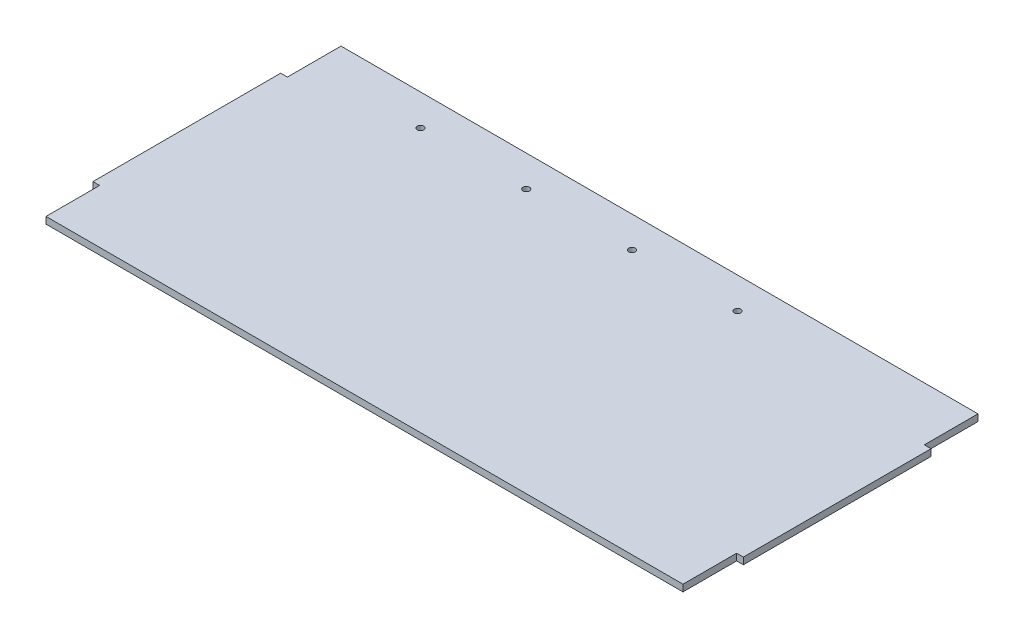
ISO-10303-21;
HEADER;
FILE_DESCRIPTION(('STEP AP214'),'2;1');
FILE_NAME('part.step','',(''),(''),'','','');
FILE_SCHEMA(('AUTOMOTIVE_DESIGN { 1 0 10303 214 1 1 1 1 }'));
ENDSEC;
DATA;
#1=APPLICATION_CONTEXT('core data for automotive mechanical design processes');
#2=APPLICATION_PROTOCOL_DEFINITION('international standard','automotive_design',2000,#1);
#3=PRODUCT_CONTEXT('',#1,'mechanical');
#4=PRODUCT('Part','Part','',(#3));
#5=PRODUCT_RELATED_PRODUCT_CATEGORY('part','',(#4));
#6=PRODUCT_DEFINITION_FORMATION('','',#4);
#7=PRODUCT_DEFINITION_CONTEXT('part definition',#1,'design');
#8=PRODUCT_DEFINITION('design','',#6,#7);
#9=PRODUCT_DEFINITION_SHAPE('','',#8);
#10=(LENGTH_UNIT() NAMED_UNIT(*) SI_UNIT(.MILLI.,.METRE.));
#11=(NAMED_UNIT(*) PLANE_ANGLE_UNIT() SI_UNIT($,.RADIAN.));
#12=(NAMED_UNIT(*) SI_UNIT($,.STERADIAN.) SOLID_ANGLE_UNIT());
#13=UNCERTAINTY_MEASURE_WITH_UNIT(LENGTH_MEASURE(1.E-05),#10,'distance_accuracy_value','');
#14=(GEOMETRIC_REPRESENTATION_CONTEXT(3) GLOBAL_UNCERTAINTY_ASSIGNED_CONTEXT((#13)) GLOBAL_UNIT_ASSIGNED_CONTEXT((#10,
#11,#12)) REPRESENTATION_CONTEXT('',''));
#15=CARTESIAN_POINT('',(0.,0.,0.));
#16=DIRECTION('',(0.,0.,1.));
#17=DIRECTION('',(1.,0.,0.));
#18=AXIS2_PLACEMENT_3D('',#15,#16,#17);
#19=CARTESIAN_POINT('',(150.8125,3.175,-44.45));
#20=DIRECTION('',(-1.,0.,0.));
#21=DIRECTION('',(0.,0.,1.));
#22=AXIS2_PLACEMENT_3D('',#19,#20,#21);
#23=PLANE('',#22);
#24=DIRECTION('',(0.,0.,-1.));
#25=VECTOR('',#24,1.);
#26=CARTESIAN_POINT('',(150.8125,0.,-44.45));
#27=LINE('',#26,#25);
#28=CARTESIAN_POINT('',(150.8125,0.,-44.45));
#29=VERTEX_POINT('',#28);
#30=CARTESIAN_POINT('',(150.8125,0.,-69.85));
#31=VERTEX_POINT('',#30);
#32=EDGE_CURVE('E155',#29,#31,#27,.T.);
#33=ORIENTED_EDGE('',*,*,#32,.T.);
#34=DIRECTION('',(0.,-1.,0.));
#35=VECTOR('',#34,1.);
#36=CARTESIAN_POINT('',(150.8125,3.175,-69.85));
#37=LINE('',#36,#35);
#38=CARTESIAN_POINT('',(150.8125,3.175,-69.85));
#39=VERTEX_POINT('',#38);
#40=EDGE_CURVE('E11',#39,#31,#37,.T.);
#41=ORIENTED_EDGE('',*,*,#40,.F.);
#42=DIRECTION('',(0.,0.,-1.));
#43=VECTOR('',#42,1.);
#44=CARTESIAN_POINT('',(150.8125,3.175,-44.45));
#45=LINE('',#44,#43);
#46=CARTESIAN_POINT('',(150.8125,3.175,-44.45));
#47=VERTEX_POINT('',#46);
#48=EDGE_CURVE('E178',#47,#39,#45,.T.);
#49=ORIENTED_EDGE('',*,*,#48,.F.);
#50=DIRECTION('',(0.,-1.,0.));
#51=VECTOR('',#50,1.);
#52=CARTESIAN_POINT('',(150.8125,3.175,-44.45));
#53=LINE('',#52,#51);
#54=EDGE_CURVE('E151',#47,#29,#53,.T.);
#55=ORIENTED_EDGE('',*,*,#54,.T.);
#56=EDGE_LOOP('',(#33,#41,#49,#55));
#57=FACE_BOUND('',#56,.T.);
#58=ADVANCED_FACE('F35',(#57),#23,.F.);
#59=CARTESIAN_POINT('',(-150.8125,3.175,-69.85));
#60=DIRECTION('',(0.,0.,1.));
#61=DIRECTION('',(1.,0.,0.));
#62=AXIS2_PLACEMENT_3D('',#59,#60,#61);
#63=PLANE('',#62);
#64=DIRECTION('',(-1.,0.,0.));
#65=VECTOR('',#64,1.);
#66=CARTESIAN_POINT('',(-150.8125,0.,-69.85));
#67=LINE('',#66,#65);
#68=CARTESIAN_POINT('',(-150.8125,0.,-69.85));
#69=VERTEX_POINT('',#68);
#70=EDGE_CURVE('E158',#31,#69,#67,.T.);
#71=ORIENTED_EDGE('',*,*,#70,.T.);
#72=DIRECTION('',(0.,-1.,0.));
#73=VECTOR('',#72,1.);
#74=CARTESIAN_POINT('',(-150.8125,3.175,-69.85));
#75=LINE('',#74,#73);
#76=CARTESIAN_POINT('',(-150.8125,3.175,-69.85));
#77=VERTEX_POINT('',#76);
#78=EDGE_CURVE('E43',#77,#69,#75,.T.);
#79=ORIENTED_EDGE('',*,*,#78,.F.);
#80=DIRECTION('',(-1.,0.,0.));
#81=VECTOR('',#80,1.);
#82=CARTESIAN_POINT('',(-150.8125,3.175,-69.85));
#83=LINE('',#82,#81);
#84=EDGE_CURVE('E106',#39,#77,#83,.T.);
#85=ORIENTED_EDGE('',*,*,#84,.F.);
#86=ORIENTED_EDGE('',*,*,#40,.T.);
#87=EDGE_LOOP('',(#71,#79,#85,#86));
#88=FACE_BOUND('',#87,.T.);
#89=ADVANCED_FACE('F257',(#88),#63,.F.);
#90=CARTESIAN_POINT('',(-150.8125,3.175,-44.45));
#91=DIRECTION('',(1.,0.,0.));
#92=DIRECTION('',(0.,0.,-1.));
#93=AXIS2_PLACEMENT_3D('',#90,#91,#92);
#94=PLANE('',#93);
#95=DIRECTION('',(0.,0.,1.));
#96=VECTOR('',#95,1.);
#97=CARTESIAN_POINT('',(-150.8125,0.,-44.45));
#98=LINE('',#97,#96);
#99=CARTESIAN_POINT('',(-150.8125,0.,-44.45));
#100=VERTEX_POINT('',#99);
#101=EDGE_CURVE('E161',#69,#100,#98,.T.);
#102=ORIENTED_EDGE('',*,*,#101,.T.);
#103=DIRECTION('',(0.,-1.,0.));
#104=VECTOR('',#103,1.);
#105=CARTESIAN_POINT('',(-150.8125,3.175,-44.45));
#106=LINE('',#105,#104);
#107=CARTESIAN_POINT('',(-150.8125,3.175,-44.45));
#108=VERTEX_POINT('',#107);
#109=EDGE_CURVE('E197',#108,#100,#106,.T.);
#110=ORIENTED_EDGE('',*,*,#109,.F.);
#111=DIRECTION('',(0.,0.,1.));
#112=VECTOR('',#111,1.);
#113=CARTESIAN_POINT('',(-150.8125,3.175,-44.45));
#114=LINE('',#113,#112);
#115=EDGE_CURVE('E205',#77,#108,#114,.T.);
#116=ORIENTED_EDGE('',*,*,#115,.F.);
#117=ORIENTED_EDGE('',*,*,#78,.T.);
#118=EDGE_LOOP('',(#102,#110,#116,#117));
#119=FACE_BOUND('',#118,.T.);
#120=ADVANCED_FACE('F203',(#119),#94,.F.);
#121=CARTESIAN_POINT('',(-150.8125,3.175,-44.45));
#122=DIRECTION('',(0.,0.,1.));
#123=DIRECTION('',(1.,0.,0.));
#124=AXIS2_PLACEMENT_3D('',#121,#122,#123);
#125=PLANE('',#124);
#126=DIRECTION('',(-1.,0.,0.));
#127=VECTOR('',#126,1.);
#128=CARTESIAN_POINT('',(-150.8125,0.,-44.45));
#129=LINE('',#128,#127);
#130=CARTESIAN_POINT('',(-153.9875,0.,-44.45));
#131=VERTEX_POINT('',#130);
#132=EDGE_CURVE('E163',#100,#131,#129,.T.);
#133=ORIENTED_EDGE('',*,*,#132,.T.);
#134=DIRECTION('',(0.,-1.,0.));
#135=VECTOR('',#134,1.);
#136=CARTESIAN_POINT('',(-153.9875,3.175,-44.45));
#137=LINE('',#136,#135);
#138=CARTESIAN_POINT('',(-153.9875,3.175,-44.45));
#139=VERTEX_POINT('',#138);
#140=EDGE_CURVE('E194',#139,#131,#137,.T.);
#141=ORIENTED_EDGE('',*,*,#140,.F.);
#142=DIRECTION('',(-1.,0.,0.));
#143=VECTOR('',#142,1.);
#144=CARTESIAN_POINT('',(-150.8125,3.175,-44.45));
#145=LINE('',#144,#143);
#146=EDGE_CURVE('E223',#108,#139,#145,.T.);
#147=ORIENTED_EDGE('',*,*,#146,.F.);
#148=ORIENTED_EDGE('',*,*,#109,.T.);
#149=EDGE_LOOP('',(#133,#141,#147,#148));
#150=FACE_BOUND('',#149,.T.);
#151=ADVANCED_FACE('F214',(#150),#125,.F.);
#152=CARTESIAN_POINT('',(-153.9875,3.175,-44.45));
#153=DIRECTION('',(1.,0.,0.));
#154=DIRECTION('',(0.,0.,-1.));
#155=AXIS2_PLACEMENT_3D('',#152,#153,#154);
#156=PLANE('',#155);
#157=DIRECTION('',(0.,0.,1.));
#158=VECTOR('',#157,1.);
#159=CARTESIAN_POINT('',(-153.9875,0.,-44.45));
#160=LINE('',#159,#158);
#161=CARTESIAN_POINT('',(-153.9875,0.,44.45));
#162=VERTEX_POINT('',#161);
#163=EDGE_CURVE('E165',#131,#162,#160,.T.);
#164=ORIENTED_EDGE('',*,*,#163,.T.);
#165=DIRECTION('',(0.,-1.,0.));
#166=VECTOR('',#165,1.);
#167=CARTESIAN_POINT('',(-153.9875,3.175,44.45));
#168=LINE('',#167,#166);
#169=CARTESIAN_POINT('',(-153.9875,3.175,44.45));
#170=VERTEX_POINT('',#169);
#171=EDGE_CURVE('E191',#170,#162,#168,.T.);
#172=ORIENTED_EDGE('',*,*,#171,.F.);
#173=DIRECTION('',(0.,0.,1.));
#174=VECTOR('',#173,1.);
#175=CARTESIAN_POINT('',(-153.9875,3.175,-44.45));
#176=LINE('',#175,#174);
#177=EDGE_CURVE('E220',#139,#170,#176,.T.);
#178=ORIENTED_EDGE('',*,*,#177,.F.);
#179=ORIENTED_EDGE('',*,*,#140,.T.);
#180=EDGE_LOOP('',(#164,#172,#178,#179));
#181=FACE_BOUND('',#180,.T.);
#182=ADVANCED_FACE('F218',(#181),#156,.F.);
#183=CARTESIAN_POINT('',(-153.9875,3.175,44.45));
#184=DIRECTION('',(0.,0.,-1.));
#185=DIRECTION('',(-1.,0.,0.));
#186=AXIS2_PLACEMENT_3D('',#183,#184,#185);
#187=PLANE('',#186);
#188=DIRECTION('',(1.,0.,0.));
#189=VECTOR('',#188,1.);
#190=CARTESIAN_POINT('',(-153.9875,0.,44.45));
#191=LINE('',#190,#189);
#192=CARTESIAN_POINT('',(-150.8125,0.,44.45));
#193=VERTEX_POINT('',#192);
#194=EDGE_CURVE('E167',#162,#193,#191,.T.);
#195=ORIENTED_EDGE('',*,*,#194,.T.);
#196=DIRECTION('',(0.,-1.,0.));
#197=VECTOR('',#196,1.);
#198=CARTESIAN_POINT('',(-150.8125,3.175,44.45));
#199=LINE('',#198,#197);
#200=CARTESIAN_POINT('',(-150.8125,3.175,44.45));
#201=VERTEX_POINT('',#200);
#202=EDGE_CURVE('E188',#201,#193,#199,.T.);
#203=ORIENTED_EDGE('',*,*,#202,.F.);
#204=DIRECTION('',(1.,0.,0.));
#205=VECTOR('',#204,1.);
#206=CARTESIAN_POINT('',(-153.9875,3.175,44.45));
#207=LINE('',#206,#205);
#208=EDGE_CURVE('E222',#170,#201,#207,.T.);
#209=ORIENTED_EDGE('',*,*,#208,.F.);
#210=ORIENTED_EDGE('',*,*,#171,.T.);
#211=EDGE_LOOP('',(#195,#203,#209,#210));
#212=FACE_BOUND('',#211,.T.);
#213=ADVANCED_FACE('F270',(#212),#187,.F.);
#214=CARTESIAN_POINT('',(-150.8125,3.175,69.85));
#215=DIRECTION('',(1.,0.,0.));
#216=DIRECTION('',(0.,0.,-1.));
#217=AXIS2_PLACEMENT_3D('',#214,#215,#216);
#218=PLANE('',#217);
#219=DIRECTION('',(0.,0.,1.));
#220=VECTOR('',#219,1.);
#221=CARTESIAN_POINT('',(-150.8125,0.,69.85));
#222=LINE('',#221,#220);
#223=CARTESIAN_POINT('',(-150.8125,0.,69.85));
#224=VERTEX_POINT('',#223);
#225=EDGE_CURVE('E169',#193,#224,#222,.T.);
#226=ORIENTED_EDGE('',*,*,#225,.T.);
#227=DIRECTION('',(0.,-1.,0.));
#228=VECTOR('',#227,1.);
#229=CARTESIAN_POINT('',(-150.8125,3.175,69.85));
#230=LINE('',#229,#228);
#231=CARTESIAN_POINT('',(-150.8125,3.175,69.85));
#232=VERTEX_POINT('',#231);
#233=EDGE_CURVE('E185',#232,#224,#230,.T.);
#234=ORIENTED_EDGE('',*,*,#233,.F.);
#235=DIRECTION('',(0.,0.,1.));
#236=VECTOR('',#235,1.);
#237=CARTESIAN_POINT('',(-150.8125,3.175,69.85));
#238=LINE('',#237,#236);
#239=EDGE_CURVE('E225',#201,#232,#238,.T.);
#240=ORIENTED_EDGE('',*,*,#239,.F.);
#241=ORIENTED_EDGE('',*,*,#202,.T.);
#242=EDGE_LOOP('',(#226,#234,#240,#241));
#243=FACE_BOUND('',#242,.T.);
#244=ADVANCED_FACE('F273',(#243),#218,.F.);
#245=CARTESIAN_POINT('',(-150.8125,3.175,69.85));
#246=DIRECTION('',(0.,0.,-1.));
#247=DIRECTION('',(-1.,0.,0.));
#248=AXIS2_PLACEMENT_3D('',#245,#246,#247);
#249=PLANE('',#248);
#250=DIRECTION('',(1.,0.,0.));
#251=VECTOR('',#250,1.);
#252=CARTESIAN_POINT('',(-150.8125,0.,69.85));
#253=LINE('',#252,#251);
#254=CARTESIAN_POINT('',(150.8125,0.,69.85));
#255=VERTEX_POINT('',#254);
#256=EDGE_CURVE('E171',#224,#255,#253,.T.);
#257=ORIENTED_EDGE('',*,*,#256,.T.);
#258=DIRECTION('',(0.,-1.,0.));
#259=VECTOR('',#258,1.);
#260=CARTESIAN_POINT('',(150.8125,3.175,69.85));
#261=LINE('',#260,#259);
#262=CARTESIAN_POINT('',(150.8125,3.175,69.85));
#263=VERTEX_POINT('',#262);
#264=EDGE_CURVE('E182',#263,#255,#261,.T.);
#265=ORIENTED_EDGE('',*,*,#264,.F.);
#266=DIRECTION('',(1.,0.,0.));
#267=VECTOR('',#266,1.);
#268=CARTESIAN_POINT('',(-150.8125,3.175,69.85));
#269=LINE('',#268,#267);
#270=EDGE_CURVE('E231',#232,#263,#269,.T.);
#271=ORIENTED_EDGE('',*,*,#270,.F.);
#272=ORIENTED_EDGE('',*,*,#233,.T.);
#273=EDGE_LOOP('',(#257,#265,#271,#272));
#274=FACE_BOUND('',#273,.T.);
#275=ADVANCED_FACE('F237',(#274),#249,.F.);
#276=CARTESIAN_POINT('',(150.8125,3.175,69.85));
#277=DIRECTION('',(-1.,0.,0.));
#278=DIRECTION('',(0.,0.,1.));
#279=AXIS2_PLACEMENT_3D('',#276,#277,#278);
#280=PLANE('',#279);
#281=DIRECTION('',(0.,0.,-1.));
#282=VECTOR('',#281,1.);
#283=CARTESIAN_POINT('',(150.8125,0.,69.85));
#284=LINE('',#283,#282);
#285=CARTESIAN_POINT('',(150.8125,0.,44.45));
#286=VERTEX_POINT('',#285);
#287=EDGE_CURVE('E173',#255,#286,#284,.T.);
#288=ORIENTED_EDGE('',*,*,#287,.T.);
#289=DIRECTION('',(0.,-1.,0.));
#290=VECTOR('',#289,1.);
#291=CARTESIAN_POINT('',(150.8125,3.175,44.45));
#292=LINE('',#291,#290);
#293=CARTESIAN_POINT('',(150.8125,3.175,44.45));
#294=VERTEX_POINT('',#293);
#295=EDGE_CURVE('E146',#294,#286,#292,.T.);
#296=ORIENTED_EDGE('',*,*,#295,.F.);
#297=DIRECTION('',(0.,0.,-1.));
#298=VECTOR('',#297,1.);
#299=CARTESIAN_POINT('',(150.8125,3.175,69.85));
#300=LINE('',#299,#298);
#301=EDGE_CURVE('E137',#263,#294,#300,.T.);
#302=ORIENTED_EDGE('',*,*,#301,.F.);
#303=ORIENTED_EDGE('',*,*,#264,.T.);
#304=EDGE_LOOP('',(#288,#296,#302,#303));
#305=FACE_BOUND('',#304,.T.);
#306=ADVANCED_FACE('F241',(#305),#280,.F.);
#307=CARTESIAN_POINT('',(153.9875,3.175,44.45));
#308=DIRECTION('',(0.,0.,-1.));
#309=DIRECTION('',(-1.,0.,0.));
#310=AXIS2_PLACEMENT_3D('',#307,#308,#309);
#311=PLANE('',#310);
#312=DIRECTION('',(1.,0.,0.));
#313=VECTOR('',#312,1.);
#314=CARTESIAN_POINT('',(153.9875,0.,44.45));
#315=LINE('',#314,#313);
#316=CARTESIAN_POINT('',(153.9875,0.,44.45));
#317=VERTEX_POINT('',#316);
#318=EDGE_CURVE('E145',#286,#317,#315,.T.);
#319=ORIENTED_EDGE('',*,*,#318,.T.);
#320=DIRECTION('',(0.,-1.,0.));
#321=VECTOR('',#320,1.);
#322=CARTESIAN_POINT('',(153.9875,3.175,44.45));
#323=LINE('',#322,#321);
#324=CARTESIAN_POINT('',(153.9875,3.175,44.45));
#325=VERTEX_POINT('',#324);
#326=EDGE_CURVE('E142',#325,#317,#323,.T.);
#327=ORIENTED_EDGE('',*,*,#326,.F.);
#328=DIRECTION('',(1.,0.,0.));
#329=VECTOR('',#328,1.);
#330=CARTESIAN_POINT('',(153.9875,3.175,44.45));
#331=LINE('',#330,#329);
#332=EDGE_CURVE('E131',#294,#325,#331,.T.);
#333=ORIENTED_EDGE('',*,*,#332,.F.);
#334=ORIENTED_EDGE('',*,*,#295,.T.);
#335=EDGE_LOOP('',(#319,#327,#333,#334));
#336=FACE_BOUND('',#335,.T.);
#337=ADVANCED_FACE('F143',(#336),#311,.F.);
#338=CARTESIAN_POINT('',(153.9875,3.175,-44.45));
#339=DIRECTION('',(-1.,0.,0.));
#340=DIRECTION('',(0.,0.,1.));
#341=AXIS2_PLACEMENT_3D('',#338,#339,#340);
#342=PLANE('',#341);
#343=DIRECTION('',(0.,0.,-1.));
#344=VECTOR('',#343,1.);
#345=CARTESIAN_POINT('',(153.9875,0.,-44.45));
#346=LINE('',#345,#344);
#347=CARTESIAN_POINT('',(153.9875,0.,-44.45));
#348=VERTEX_POINT('',#347);
#349=EDGE_CURVE('E92',#317,#348,#346,.T.);
#350=ORIENTED_EDGE('',*,*,#349,.T.);
#351=DIRECTION('',(0.,-1.,0.));
#352=VECTOR('',#351,1.);
#353=CARTESIAN_POINT('',(153.9875,3.175,-44.45));
#354=LINE('',#353,#352);
#355=CARTESIAN_POINT('',(153.9875,3.175,-44.45));
#356=VERTEX_POINT('',#355);
#357=EDGE_CURVE('E147',#356,#348,#354,.T.);
#358=ORIENTED_EDGE('',*,*,#357,.F.);
#359=DIRECTION('',(0.,0.,-1.));
#360=VECTOR('',#359,1.);
#361=CARTESIAN_POINT('',(153.9875,3.175,-44.45));
#362=LINE('',#361,#360);
#363=EDGE_CURVE('E135',#325,#356,#362,.T.);
#364=ORIENTED_EDGE('',*,*,#363,.F.);
#365=ORIENTED_EDGE('',*,*,#326,.T.);
#366=EDGE_LOOP('',(#350,#358,#364,#365));
#367=FACE_BOUND('',#366,.T.);
#368=ADVANCED_FACE('F149',(#367),#342,.F.);
#369=CARTESIAN_POINT('',(150.8125,3.175,-44.45));
#370=DIRECTION('',(0.,0.,1.));
#371=DIRECTION('',(1.,0.,0.));
#372=AXIS2_PLACEMENT_3D('',#369,#370,#371);
#373=PLANE('',#372);
#374=DIRECTION('',(-1.,0.,0.));
#375=VECTOR('',#374,1.);
#376=CARTESIAN_POINT('',(150.8125,0.,-44.45));
#377=LINE('',#376,#375);
#378=EDGE_CURVE('E98',#348,#29,#377,.T.);
#379=ORIENTED_EDGE('',*,*,#378,.T.);
#380=ORIENTED_EDGE('',*,*,#54,.F.);
#381=DIRECTION('',(-1.,0.,0.));
#382=VECTOR('',#381,1.);
#383=CARTESIAN_POINT('',(150.8125,3.175,-44.45));
#384=LINE('',#383,#382);
#385=EDGE_CURVE('E51',#356,#47,#384,.T.);
#386=ORIENTED_EDGE('',*,*,#385,.F.);
#387=ORIENTED_EDGE('',*,*,#357,.T.);
#388=EDGE_LOOP('',(#379,#380,#386,#387));
#389=FACE_BOUND('',#388,.T.);
#390=ADVANCED_FACE('F245',(#389),#373,.F.);
#391=CARTESIAN_POINT('',(0.,3.175,0.));
#392=DIRECTION('',(0.,-1.,0.));
#393=DIRECTION('',(0.,0.,-1.));
#394=AXIS2_PLACEMENT_3D('',#391,#392,#393);
#395=PLANE('',#394);
#396=CARTESIAN_POINT('',(-98.3703900000001,3.175,-55.087774));
#397=DIRECTION('',(0.,1.,0.));
#398=DIRECTION('',(0.,0.,1.));
#399=AXIS2_PLACEMENT_3D('',#396,#397,#398);
#400=CIRCLE('',#399,1.54940000000001);
#401=CARTESIAN_POINT('',(-98.3703900000001,3.175,-53.538374));
#402=VERTEX_POINT('',#401);
#403=EDGE_CURVE('E405',#402,#402,#400,.T.);
#404=ORIENTED_EDGE('',*,*,#403,.F.);
#405=EDGE_LOOP('',(#404));
#406=FACE_BOUND('',#405,.T.);
#407=CARTESIAN_POINT('',(-48.3323900000001,3.175,-55.087774));
#408=DIRECTION('',(0.,1.,0.));
#409=DIRECTION('',(0.,0.,1.));
#410=AXIS2_PLACEMENT_3D('',#407,#408,#409);
#411=CIRCLE('',#410,1.5494);
#412=CARTESIAN_POINT('',(-48.3323900000001,3.175,-53.538374));
#413=VERTEX_POINT('',#412);
#414=EDGE_CURVE('E410',#413,#413,#411,.T.);
#415=ORIENTED_EDGE('',*,*,#414,.F.);
#416=EDGE_LOOP('',(#415));
#417=FACE_BOUND('',#416,.T.);
#418=CARTESIAN_POINT('',(1.70560999999994,3.175,-55.087774));
#419=DIRECTION('',(0.,1.,0.));
#420=DIRECTION('',(0.,0.,1.));
#421=AXIS2_PLACEMENT_3D('',#418,#419,#420);
#422=CIRCLE('',#421,1.5494);
#423=CARTESIAN_POINT('',(1.70560999999994,3.175,-53.538374));
#424=VERTEX_POINT('',#423);
#425=EDGE_CURVE('E418',#424,#424,#422,.T.);
#426=ORIENTED_EDGE('',*,*,#425,.F.);
#427=EDGE_LOOP('',(#426));
#428=FACE_BOUND('',#427,.T.);
#429=CARTESIAN_POINT('',(51.7436099999999,3.175,-55.087774));
#430=DIRECTION('',(0.,1.,0.));
#431=DIRECTION('',(0.,0.,1.));
#432=AXIS2_PLACEMENT_3D('',#429,#430,#431);
#433=CIRCLE('',#432,1.5494);
#434=CARTESIAN_POINT('',(51.7436099999999,3.175,-53.538374));
#435=VERTEX_POINT('',#434);
#436=EDGE_CURVE('E424',#435,#435,#433,.T.);
#437=ORIENTED_EDGE('',*,*,#436,.F.);
#438=EDGE_LOOP('',(#437));
#439=FACE_BOUND('',#438,.T.);
#440=ORIENTED_EDGE('',*,*,#48,.T.);
#441=ORIENTED_EDGE('',*,*,#84,.T.);
#442=ORIENTED_EDGE('',*,*,#115,.T.);
#443=ORIENTED_EDGE('',*,*,#146,.T.);
#444=ORIENTED_EDGE('',*,*,#177,.T.);
#445=ORIENTED_EDGE('',*,*,#208,.T.);
#446=ORIENTED_EDGE('',*,*,#239,.T.);
#447=ORIENTED_EDGE('',*,*,#270,.T.);
#448=ORIENTED_EDGE('',*,*,#301,.T.);
#449=ORIENTED_EDGE('',*,*,#332,.T.);
#450=ORIENTED_EDGE('',*,*,#363,.T.);
#451=ORIENTED_EDGE('',*,*,#385,.T.);
#452=EDGE_LOOP('',(#440,#441,#442,#443,#444,#445,#446,#447,#448,#449,#450,#451));
#453=FACE_BOUND('',#452,.T.);
#454=ADVANCED_FACE('F133',(#406,#417,#428,#439,#453),#395,.F.);
#455=CARTESIAN_POINT('',(0.,0.,0.));
#456=DIRECTION('',(0.,-1.,0.));
#457=DIRECTION('',(0.,0.,-1.));
#458=AXIS2_PLACEMENT_3D('',#455,#456,#457);
#459=PLANE('',#458);
#460=CARTESIAN_POINT('',(-98.3703900000001,0.,-55.087774));
#461=DIRECTION('',(0.,1.,0.));
#462=DIRECTION('',(0.,0.,1.));
#463=AXIS2_PLACEMENT_3D('',#460,#461,#462);
#464=CIRCLE('',#463,1.54940000000001);
#465=CARTESIAN_POINT('',(-98.3703900000001,0.,-53.538374));
#466=VERTEX_POINT('',#465);
#467=EDGE_CURVE('E159',#466,#466,#464,.T.);
#468=ORIENTED_EDGE('',*,*,#467,.T.);
#469=EDGE_LOOP('',(#468));
#470=FACE_BOUND('',#469,.T.);
#471=CARTESIAN_POINT('',(-48.3323900000001,0.,-55.087774));
#472=DIRECTION('',(0.,1.,0.));
#473=DIRECTION('',(0.,0.,1.));
#474=AXIS2_PLACEMENT_3D('',#471,#472,#473);
#475=CIRCLE('',#474,1.5494);
#476=CARTESIAN_POINT('',(-48.3323900000001,0.,-53.538374));
#477=VERTEX_POINT('',#476);
#478=EDGE_CURVE('E406',#477,#477,#475,.T.);
#479=ORIENTED_EDGE('',*,*,#478,.T.);
#480=EDGE_LOOP('',(#479));
#481=FACE_BOUND('',#480,.T.);
#482=CARTESIAN_POINT('',(1.70560999999994,0.,-55.087774));
#483=DIRECTION('',(0.,1.,0.));
#484=DIRECTION('',(0.,0.,1.));
#485=AXIS2_PLACEMENT_3D('',#482,#483,#484);
#486=CIRCLE('',#485,1.5494);
#487=CARTESIAN_POINT('',(1.70560999999994,0.,-53.538374));
#488=VERTEX_POINT('',#487);
#489=EDGE_CURVE('E415',#488,#488,#486,.T.);
#490=ORIENTED_EDGE('',*,*,#489,.T.);
#491=EDGE_LOOP('',(#490));
#492=FACE_BOUND('',#491,.T.);
#493=CARTESIAN_POINT('',(51.7436099999999,0.,-55.087774));
#494=DIRECTION('',(0.,1.,0.));
#495=DIRECTION('',(0.,0.,1.));
#496=AXIS2_PLACEMENT_3D('',#493,#494,#495);
#497=CIRCLE('',#496,1.5494);
#498=CARTESIAN_POINT('',(51.7436099999999,0.,-53.538374));
#499=VERTEX_POINT('',#498);
#500=EDGE_CURVE('E421',#499,#499,#497,.T.);
#501=ORIENTED_EDGE('',*,*,#500,.T.);
#502=EDGE_LOOP('',(#501));
#503=FACE_BOUND('',#502,.T.);
#504=ORIENTED_EDGE('',*,*,#32,.F.);
#505=ORIENTED_EDGE('',*,*,#378,.F.);
#506=ORIENTED_EDGE('',*,*,#349,.F.);
#507=ORIENTED_EDGE('',*,*,#318,.F.);
#508=ORIENTED_EDGE('',*,*,#287,.F.);
#509=ORIENTED_EDGE('',*,*,#256,.F.);
#510=ORIENTED_EDGE('',*,*,#225,.F.);
#511=ORIENTED_EDGE('',*,*,#194,.F.);
#512=ORIENTED_EDGE('',*,*,#163,.F.);
#513=ORIENTED_EDGE('',*,*,#132,.F.);
#514=ORIENTED_EDGE('',*,*,#101,.F.);
#515=ORIENTED_EDGE('',*,*,#70,.F.);
#516=EDGE_LOOP('',(#504,#505,#506,#507,#508,#509,#510,#511,#512,#513,#514,#515));
#517=FACE_BOUND('',#516,.T.);
#518=ADVANCED_FACE('F209',(#470,#481,#492,#503,#517),#459,.T.);
#519=CARTESIAN_POINT('',(51.7436099999999,0.,-55.087774));
#520=DIRECTION('',(0.,1.,0.));
#521=DIRECTION('',(0.,0.,1.));
#522=AXIS2_PLACEMENT_3D('',#519,#520,#521);
#523=CYLINDRICAL_SURFACE('',#522,1.5494);
#524=ORIENTED_EDGE('',*,*,#500,.F.);
#525=EDGE_LOOP('',(#524));
#526=FACE_BOUND('',#525,.T.);
#527=ORIENTED_EDGE('',*,*,#436,.T.);
#528=EDGE_LOOP('',(#527));
#529=FACE_BOUND('',#528,.T.);
#530=ADVANCED_FACE('F357',(#526,#529),#523,.F.);
#531=CARTESIAN_POINT('',(1.70560999999994,0.,-55.087774));
#532=DIRECTION('',(0.,1.,0.));
#533=DIRECTION('',(0.,0.,1.));
#534=AXIS2_PLACEMENT_3D('',#531,#532,#533);
#535=CYLINDRICAL_SURFACE('',#534,1.5494);
#536=ORIENTED_EDGE('',*,*,#489,.F.);
#537=EDGE_LOOP('',(#536));
#538=FACE_BOUND('',#537,.T.);
#539=ORIENTED_EDGE('',*,*,#425,.T.);
#540=EDGE_LOOP('',(#539));
#541=FACE_BOUND('',#540,.T.);
#542=ADVANCED_FACE('F366',(#538,#541),#535,.F.);
#543=CARTESIAN_POINT('',(-48.3323900000001,0.,-55.087774));
#544=DIRECTION('',(0.,1.,0.));
#545=DIRECTION('',(0.,0.,1.));
#546=AXIS2_PLACEMENT_3D('',#543,#544,#545);
#547=CYLINDRICAL_SURFACE('',#546,1.5494);
#548=ORIENTED_EDGE('',*,*,#478,.F.);
#549=EDGE_LOOP('',(#548));
#550=FACE_BOUND('',#549,.T.);
#551=ORIENTED_EDGE('',*,*,#414,.T.);
#552=EDGE_LOOP('',(#551));
#553=FACE_BOUND('',#552,.T.);
#554=ADVANCED_FACE('F376',(#550,#553),#547,.F.);
#555=CARTESIAN_POINT('',(-98.3703900000001,0.,-55.087774));
#556=DIRECTION('',(0.,1.,0.));
#557=DIRECTION('',(0.,0.,1.));
#558=AXIS2_PLACEMENT_3D('',#555,#556,#557);
#559=CYLINDRICAL_SURFACE('',#558,1.54940000000001);
#560=ORIENTED_EDGE('',*,*,#467,.F.);
#561=EDGE_LOOP('',(#560));
#562=FACE_BOUND('',#561,.T.);
#563=ORIENTED_EDGE('',*,*,#403,.T.);
#564=EDGE_LOOP('',(#563));
#565=FACE_BOUND('',#564,.T.);
#566=ADVANCED_FACE('F386',(#562,#565),#559,.F.);
#567=CLOSED_SHELL('',(#58,#89,#120,#151,#182,#213,#244,#275,#306,#337,#368,#390,#454,#518,#530,
#542,#554,#566));
#568=MANIFOLD_SOLID_BREP('B2',#567);
#569=ADVANCED_BREP_SHAPE_REPRESENTATION('',(#18,#568),#14);
#570=SHAPE_DEFINITION_REPRESENTATION(#9,#569);
ENDSEC;
END-ISO-10303-21;
